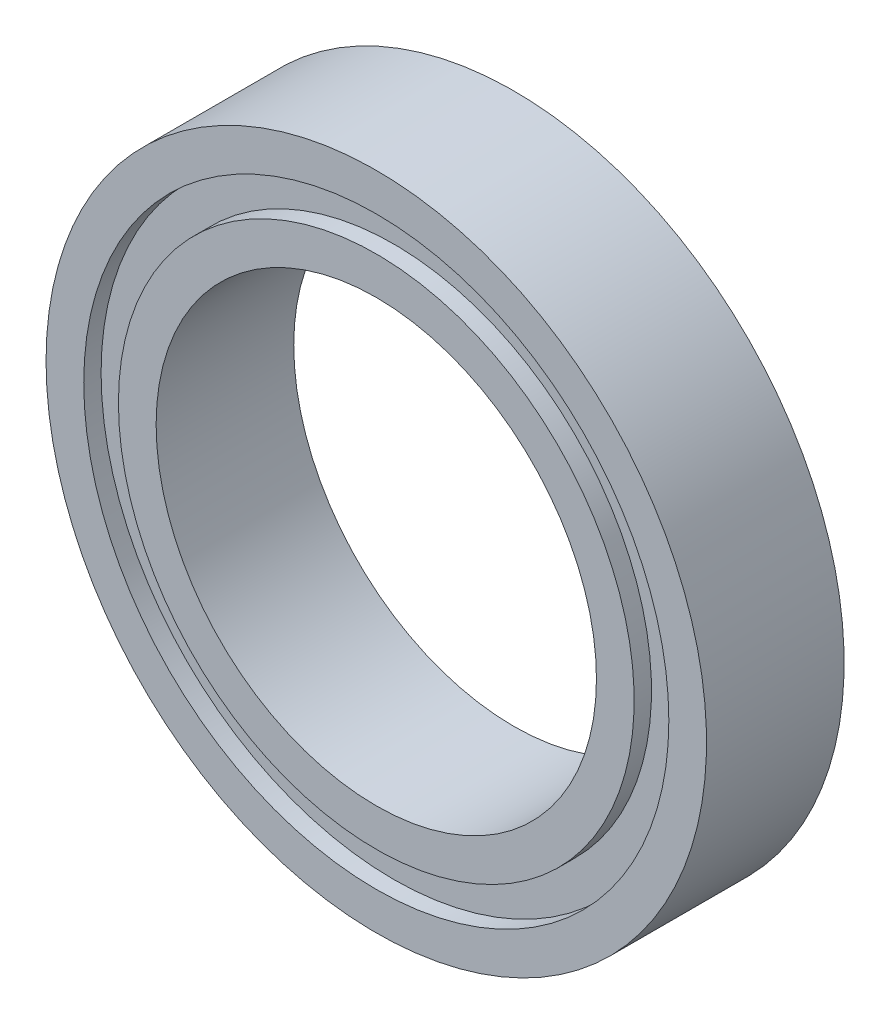
ISO-10303-21;
HEADER;
FILE_DESCRIPTION(('STEP AP214'),'2;1');
FILE_NAME('part.step','',(''),(''),'','','');
FILE_SCHEMA(('AUTOMOTIVE_DESIGN { 1 0 10303 214 1 1 1 1 }'));
ENDSEC;
DATA;
#1=APPLICATION_CONTEXT('core data for automotive mechanical design processes');
#2=APPLICATION_PROTOCOL_DEFINITION('international standard','automotive_design',2000,#1);
#3=PRODUCT_CONTEXT('',#1,'mechanical');
#4=PRODUCT('Part','Part','',(#3));
#5=PRODUCT_RELATED_PRODUCT_CATEGORY('part','',(#4));
#6=PRODUCT_DEFINITION_FORMATION('','',#4);
#7=PRODUCT_DEFINITION_CONTEXT('part definition',#1,'design');
#8=PRODUCT_DEFINITION('design','',#6,#7);
#9=PRODUCT_DEFINITION_SHAPE('','',#8);
#10=(LENGTH_UNIT() NAMED_UNIT(*) SI_UNIT(.MILLI.,.METRE.));
#11=(NAMED_UNIT(*) PLANE_ANGLE_UNIT() SI_UNIT($,.RADIAN.));
#12=(NAMED_UNIT(*) SI_UNIT($,.STERADIAN.) SOLID_ANGLE_UNIT());
#13=UNCERTAINTY_MEASURE_WITH_UNIT(LENGTH_MEASURE(1.E-05),#10,'distance_accuracy_value','');
#14=(GEOMETRIC_REPRESENTATION_CONTEXT(3) GLOBAL_UNCERTAINTY_ASSIGNED_CONTEXT((#13)) GLOBAL_UNIT_ASSIGNED_CONTEXT((#10,
#11,#12)) REPRESENTATION_CONTEXT('',''));
#15=CARTESIAN_POINT('',(0.,0.,0.));
#16=DIRECTION('',(0.,0.,1.));
#17=DIRECTION('',(1.,0.,0.));
#18=AXIS2_PLACEMENT_3D('',#15,#16,#17);
#19=CARTESIAN_POINT('',(0.,0.,-1.984375));
#20=DIRECTION('',(0.,0.,-1.));
#21=DIRECTION('',(-1.,0.,0.));
#22=AXIS2_PLACEMENT_3D('',#19,#20,#21);
#23=CYLINDRICAL_SURFACE('',#22,7.4375);
#24=CARTESIAN_POINT('',(0.,0.,-1.484375));
#25=DIRECTION('',(0.,0.,-1.));
#26=DIRECTION('',(-1.,0.,0.));
#27=AXIS2_PLACEMENT_3D('',#24,#25,#26);
#28=CIRCLE('',#27,7.4375);
#29=CARTESIAN_POINT('',(-7.4375,0.,-1.484375));
#30=VERTEX_POINT('',#29);
#31=EDGE_CURVE('E71',#30,#30,#28,.T.);
#32=ORIENTED_EDGE('',*,*,#31,.T.);
#33=EDGE_LOOP('',(#32));
#34=FACE_BOUND('',#33,.T.);
#35=CARTESIAN_POINT('',(0.,0.,-1.984375));
#36=DIRECTION('',(0.,0.,-1.));
#37=DIRECTION('',(-1.,0.,0.));
#38=AXIS2_PLACEMENT_3D('',#35,#36,#37);
#39=CIRCLE('',#38,7.4375);
#40=CARTESIAN_POINT('',(-7.4375,0.,-1.984375));
#41=VERTEX_POINT('',#40);
#42=EDGE_CURVE('E10',#41,#41,#39,.T.);
#43=ORIENTED_EDGE('',*,*,#42,.F.);
#44=EDGE_LOOP('',(#43));
#45=FACE_BOUND('',#44,.T.);
#46=ADVANCED_FACE('F31',(#34,#45),#23,.T.);
#47=CARTESIAN_POINT('',(-6.35,0.,-1.984375));
#48=DIRECTION('',(0.,0.,-1.));
#49=DIRECTION('',(-1.,0.,0.));
#50=AXIS2_PLACEMENT_3D('',#47,#48,#49);
#51=PLANE('',#50);
#52=ORIENTED_EDGE('',*,*,#42,.T.);
#53=EDGE_LOOP('',(#52));
#54=FACE_BOUND('',#53,.T.);
#55=CARTESIAN_POINT('',(0.,0.,-1.984375));
#56=DIRECTION('',(0.,0.,-1.));
#57=DIRECTION('',(-1.,0.,0.));
#58=AXIS2_PLACEMENT_3D('',#55,#56,#57);
#59=CIRCLE('',#58,6.35);
#60=CARTESIAN_POINT('',(-6.35,0.,-1.984375));
#61=VERTEX_POINT('',#60);
#62=EDGE_CURVE('E37',#61,#61,#59,.T.);
#63=ORIENTED_EDGE('',*,*,#62,.F.);
#64=EDGE_LOOP('',(#63));
#65=FACE_BOUND('',#64,.T.);
#66=ADVANCED_FACE('F89',(#54,#65),#51,.T.);
#67=CARTESIAN_POINT('',(0.,0.,-1.984375));
#68=DIRECTION('',(0.,0.,-1.));
#69=DIRECTION('',(-1.,0.,0.));
#70=AXIS2_PLACEMENT_3D('',#67,#68,#69);
#71=CYLINDRICAL_SURFACE('',#70,6.35);
#72=ORIENTED_EDGE('',*,*,#62,.T.);
#73=EDGE_LOOP('',(#72));
#74=FACE_BOUND('',#73,.T.);
#75=CARTESIAN_POINT('',(0.,0.,1.984375));
#76=DIRECTION('',(0.,0.,-1.));
#77=DIRECTION('',(-1.,0.,0.));
#78=AXIS2_PLACEMENT_3D('',#75,#76,#77);
#79=CIRCLE('',#78,6.35);
#80=CARTESIAN_POINT('',(-6.35,0.,1.984375));
#81=VERTEX_POINT('',#80);
#82=EDGE_CURVE('E41',#81,#81,#79,.T.);
#83=ORIENTED_EDGE('',*,*,#82,.F.);
#84=EDGE_LOOP('',(#83));
#85=FACE_BOUND('',#84,.T.);
#86=ADVANCED_FACE('F93',(#74,#85),#71,.F.);
#87=CARTESIAN_POINT('',(-6.35,0.,1.984375));
#88=DIRECTION('',(0.,0.,1.));
#89=DIRECTION('',(1.,0.,0.));
#90=AXIS2_PLACEMENT_3D('',#87,#88,#89);
#91=PLANE('',#90);
#92=ORIENTED_EDGE('',*,*,#82,.T.);
#93=EDGE_LOOP('',(#92));
#94=FACE_BOUND('',#93,.T.);
#95=CARTESIAN_POINT('',(0.,0.,1.984375));
#96=DIRECTION('',(0.,0.,-1.));
#97=DIRECTION('',(-1.,0.,0.));
#98=AXIS2_PLACEMENT_3D('',#95,#96,#97);
#99=CIRCLE('',#98,7.4375);
#100=CARTESIAN_POINT('',(-7.4375,0.,1.984375));
#101=VERTEX_POINT('',#100);
#102=EDGE_CURVE('E45',#101,#101,#99,.T.);
#103=ORIENTED_EDGE('',*,*,#102,.F.);
#104=EDGE_LOOP('',(#103));
#105=FACE_BOUND('',#104,.T.);
#106=ADVANCED_FACE('F97',(#94,#105),#91,.T.);
#107=CARTESIAN_POINT('',(0.,0.,-1.984375));
#108=DIRECTION('',(0.,0.,-1.));
#109=DIRECTION('',(-1.,0.,0.));
#110=AXIS2_PLACEMENT_3D('',#107,#108,#109);
#111=CYLINDRICAL_SURFACE('',#110,7.4375);
#112=ORIENTED_EDGE('',*,*,#102,.T.);
#113=EDGE_LOOP('',(#112));
#114=FACE_BOUND('',#113,.T.);
#115=CARTESIAN_POINT('',(0.,0.,1.484375));
#116=DIRECTION('',(0.,0.,-1.));
#117=DIRECTION('',(-1.,0.,0.));
#118=AXIS2_PLACEMENT_3D('',#115,#116,#117);
#119=CIRCLE('',#118,7.4375);
#120=CARTESIAN_POINT('',(-7.4375,0.,1.484375));
#121=VERTEX_POINT('',#120);
#122=EDGE_CURVE('E50',#121,#121,#119,.T.);
#123=ORIENTED_EDGE('',*,*,#122,.F.);
#124=EDGE_LOOP('',(#123));
#125=FACE_BOUND('',#124,.T.);
#126=ADVANCED_FACE('F103',(#114,#125),#111,.T.);
#127=CARTESIAN_POINT('',(-7.4375,0.,1.484375));
#128=DIRECTION('',(0.,0.,1.));
#129=DIRECTION('',(1.,0.,0.));
#130=AXIS2_PLACEMENT_3D('',#127,#128,#129);
#131=PLANE('',#130);
#132=ORIENTED_EDGE('',*,*,#122,.T.);
#133=EDGE_LOOP('',(#132));
#134=FACE_BOUND('',#133,.T.);
#135=CARTESIAN_POINT('',(0.,0.,1.484375));
#136=DIRECTION('',(0.,0.,-1.));
#137=DIRECTION('',(-1.,0.,0.));
#138=AXIS2_PLACEMENT_3D('',#135,#136,#137);
#139=CIRCLE('',#138,8.4375);
#140=CARTESIAN_POINT('',(-8.4375,0.,1.484375));
#141=VERTEX_POINT('',#140);
#142=EDGE_CURVE('E53',#141,#141,#139,.T.);
#143=ORIENTED_EDGE('',*,*,#142,.F.);
#144=EDGE_LOOP('',(#143));
#145=FACE_BOUND('',#144,.T.);
#146=ADVANCED_FACE('F107',(#134,#145),#131,.T.);
#147=CARTESIAN_POINT('',(0.,0.,-1.984375));
#148=DIRECTION('',(0.,0.,-1.));
#149=DIRECTION('',(-1.,0.,0.));
#150=AXIS2_PLACEMENT_3D('',#147,#148,#149);
#151=CYLINDRICAL_SURFACE('',#150,8.4375);
#152=ORIENTED_EDGE('',*,*,#142,.T.);
#153=EDGE_LOOP('',(#152));
#154=FACE_BOUND('',#153,.T.);
#155=CARTESIAN_POINT('',(0.,0.,1.984375));
#156=DIRECTION('',(0.,0.,-1.));
#157=DIRECTION('',(-1.,0.,0.));
#158=AXIS2_PLACEMENT_3D('',#155,#156,#157);
#159=CIRCLE('',#158,8.4375);
#160=CARTESIAN_POINT('',(-8.4375,0.,1.984375));
#161=VERTEX_POINT('',#160);
#162=EDGE_CURVE('E56',#161,#161,#159,.T.);
#163=ORIENTED_EDGE('',*,*,#162,.F.);
#164=EDGE_LOOP('',(#163));
#165=FACE_BOUND('',#164,.T.);
#166=ADVANCED_FACE('F111',(#154,#165),#151,.F.);
#167=CARTESIAN_POINT('',(-8.4375,0.,1.984375));
#168=DIRECTION('',(0.,0.,1.));
#169=DIRECTION('',(1.,0.,0.));
#170=AXIS2_PLACEMENT_3D('',#167,#168,#169);
#171=PLANE('',#170);
#172=ORIENTED_EDGE('',*,*,#162,.T.);
#173=EDGE_LOOP('',(#172));
#174=FACE_BOUND('',#173,.T.);
#175=CARTESIAN_POINT('',(0.,0.,1.984375));
#176=DIRECTION('',(0.,0.,-1.));
#177=DIRECTION('',(-1.,0.,0.));
#178=AXIS2_PLACEMENT_3D('',#175,#176,#177);
#179=CIRCLE('',#178,9.525);
#180=CARTESIAN_POINT('',(-9.525,0.,1.984375));
#181=VERTEX_POINT('',#180);
#182=EDGE_CURVE('E59',#181,#181,#179,.T.);
#183=ORIENTED_EDGE('',*,*,#182,.F.);
#184=EDGE_LOOP('',(#183));
#185=FACE_BOUND('',#184,.T.);
#186=ADVANCED_FACE('F115',(#174,#185),#171,.T.);
#187=CARTESIAN_POINT('',(0.,0.,-1.984375));
#188=DIRECTION('',(0.,0.,-1.));
#189=DIRECTION('',(-1.,0.,0.));
#190=AXIS2_PLACEMENT_3D('',#187,#188,#189);
#191=CYLINDRICAL_SURFACE('',#190,9.525);
#192=ORIENTED_EDGE('',*,*,#182,.T.);
#193=EDGE_LOOP('',(#192));
#194=FACE_BOUND('',#193,.T.);
#195=CARTESIAN_POINT('',(0.,0.,-1.984375));
#196=DIRECTION('',(0.,0.,-1.));
#197=DIRECTION('',(-1.,0.,0.));
#198=AXIS2_PLACEMENT_3D('',#195,#196,#197);
#199=CIRCLE('',#198,9.525);
#200=CARTESIAN_POINT('',(-9.525,0.,-1.984375));
#201=VERTEX_POINT('',#200);
#202=EDGE_CURVE('E62',#201,#201,#199,.T.);
#203=ORIENTED_EDGE('',*,*,#202,.F.);
#204=EDGE_LOOP('',(#203));
#205=FACE_BOUND('',#204,.T.);
#206=ADVANCED_FACE('F119',(#194,#205),#191,.T.);
#207=CARTESIAN_POINT('',(-8.4375,0.,-1.984375));
#208=DIRECTION('',(0.,0.,-1.));
#209=DIRECTION('',(-1.,0.,0.));
#210=AXIS2_PLACEMENT_3D('',#207,#208,#209);
#211=PLANE('',#210);
#212=ORIENTED_EDGE('',*,*,#202,.T.);
#213=EDGE_LOOP('',(#212));
#214=FACE_BOUND('',#213,.T.);
#215=CARTESIAN_POINT('',(0.,0.,-1.984375));
#216=DIRECTION('',(0.,0.,-1.));
#217=DIRECTION('',(-1.,0.,0.));
#218=AXIS2_PLACEMENT_3D('',#215,#216,#217);
#219=CIRCLE('',#218,8.4375);
#220=CARTESIAN_POINT('',(-8.4375,0.,-1.984375));
#221=VERTEX_POINT('',#220);
#222=EDGE_CURVE('E65',#221,#221,#219,.T.);
#223=ORIENTED_EDGE('',*,*,#222,.F.);
#224=EDGE_LOOP('',(#223));
#225=FACE_BOUND('',#224,.T.);
#226=ADVANCED_FACE('F85',(#214,#225),#211,.T.);
#227=CARTESIAN_POINT('',(0.,0.,-1.984375));
#228=DIRECTION('',(0.,0.,-1.));
#229=DIRECTION('',(-1.,0.,0.));
#230=AXIS2_PLACEMENT_3D('',#227,#228,#229);
#231=CYLINDRICAL_SURFACE('',#230,8.4375);
#232=ORIENTED_EDGE('',*,*,#222,.T.);
#233=EDGE_LOOP('',(#232));
#234=FACE_BOUND('',#233,.T.);
#235=CARTESIAN_POINT('',(0.,0.,-1.484375));
#236=DIRECTION('',(0.,0.,-1.));
#237=DIRECTION('',(-1.,0.,0.));
#238=AXIS2_PLACEMENT_3D('',#235,#236,#237);
#239=CIRCLE('',#238,8.4375);
#240=CARTESIAN_POINT('',(-8.4375,0.,-1.484375));
#241=VERTEX_POINT('',#240);
#242=EDGE_CURVE('E68',#241,#241,#239,.T.);
#243=ORIENTED_EDGE('',*,*,#242,.F.);
#244=EDGE_LOOP('',(#243));
#245=FACE_BOUND('',#244,.T.);
#246=ADVANCED_FACE('F79',(#234,#245),#231,.F.);
#247=CARTESIAN_POINT('',(-7.4375,0.,-1.484375));
#248=DIRECTION('',(0.,0.,-1.));
#249=DIRECTION('',(-1.,0.,0.));
#250=AXIS2_PLACEMENT_3D('',#247,#248,#249);
#251=PLANE('',#250);
#252=ORIENTED_EDGE('',*,*,#242,.T.);
#253=EDGE_LOOP('',(#252));
#254=FACE_BOUND('',#253,.T.);
#255=ORIENTED_EDGE('',*,*,#31,.F.);
#256=EDGE_LOOP('',(#255));
#257=FACE_BOUND('',#256,.T.);
#258=ADVANCED_FACE('F77',(#254,#257),#251,.T.);
#259=CLOSED_SHELL('',(#46,#66,#86,#106,#126,#146,#166,#186,#206,#226,#246,#258));
#260=MANIFOLD_SOLID_BREP('B2',#259);
#261=ADVANCED_BREP_SHAPE_REPRESENTATION('',(#18,#260),#14);
#262=SHAPE_DEFINITION_REPRESENTATION(#9,#261);
ENDSEC;
END-ISO-10303-21;
